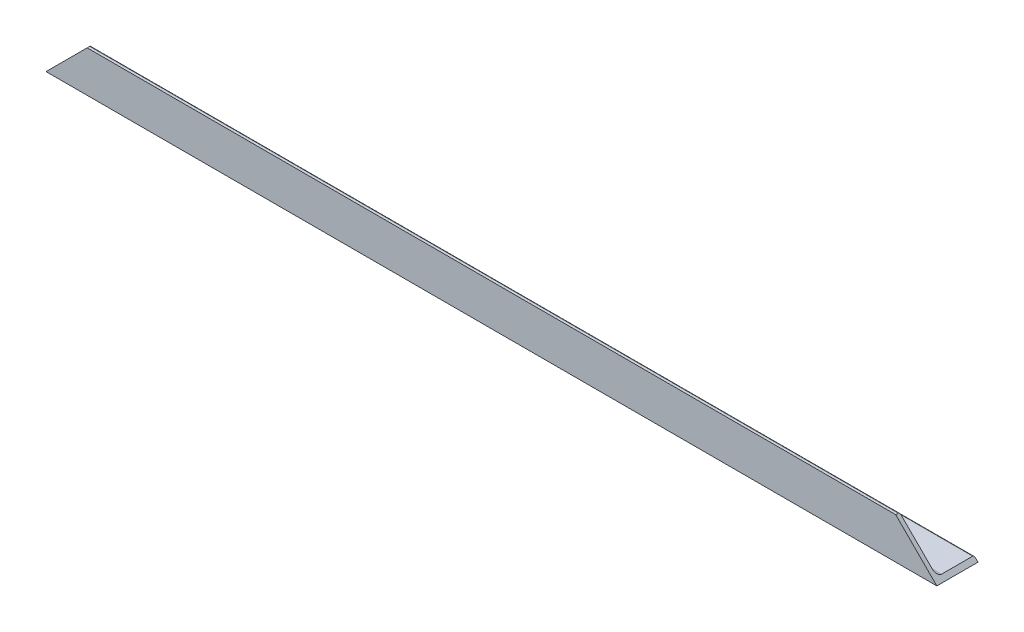
ISO-10303-21;
HEADER;
FILE_DESCRIPTION(('STEP AP214'),'2;1');
FILE_NAME('part.step','',(''),(''),'','','');
FILE_SCHEMA(('AUTOMOTIVE_DESIGN { 1 0 10303 214 1 1 1 1 }'));
ENDSEC;
DATA;
#1=APPLICATION_CONTEXT('core data for automotive mechanical design processes');
#2=APPLICATION_PROTOCOL_DEFINITION('international standard','automotive_design',2000,#1);
#3=PRODUCT_CONTEXT('',#1,'mechanical');
#4=PRODUCT('Part','Part','',(#3));
#5=PRODUCT_RELATED_PRODUCT_CATEGORY('part','',(#4));
#6=PRODUCT_DEFINITION_FORMATION('','',#4);
#7=PRODUCT_DEFINITION_CONTEXT('part definition',#1,'design');
#8=PRODUCT_DEFINITION('design','',#6,#7);
#9=PRODUCT_DEFINITION_SHAPE('','',#8);
#10=(LENGTH_UNIT() NAMED_UNIT(*) SI_UNIT(.MILLI.,.METRE.));
#11=(NAMED_UNIT(*) PLANE_ANGLE_UNIT() SI_UNIT($,.RADIAN.));
#12=(NAMED_UNIT(*) SI_UNIT($,.STERADIAN.) SOLID_ANGLE_UNIT());
#13=UNCERTAINTY_MEASURE_WITH_UNIT(LENGTH_MEASURE(1.E-05),#10,'distance_accuracy_value','');
#14=(GEOMETRIC_REPRESENTATION_CONTEXT(3) GLOBAL_UNCERTAINTY_ASSIGNED_CONTEXT((#13)) GLOBAL_UNIT_ASSIGNED_CONTEXT((#10,
#11,#12)) REPRESENTATION_CONTEXT('',''));
#15=CARTESIAN_POINT('',(0.,0.,0.));
#16=DIRECTION('',(0.,0.,1.));
#17=DIRECTION('',(1.,0.,0.));
#18=AXIS2_PLACEMENT_3D('',#15,#16,#17);
#19=CARTESIAN_POINT('',(-664.354376539067,622.645623460936,482.354376539065));
#20=DIRECTION('',(-0.707106781186548,0.707106781186547,0.));
#21=DIRECTION('',(-0.707106781186547,-0.707106781186548,0.));
#22=AXIS2_PLACEMENT_3D('',#19,#20,#21);
#23=PLANE('',#22);
#24=DIRECTION('',(0.,0.,-1.));
#25=VECTOR('',#24,1.);
#26=CARTESIAN_POINT('',(-619.000000000003,668.,499.999999999962));
#27=LINE('',#26,#25);
#28=CARTESIAN_POINT('',(-619.000000000003,668.,500.000000000001));
#29=VERTEX_POINT('',#28);
#30=CARTESIAN_POINT('',(-619.000000000003,668.,496.300000000001));
#31=VERTEX_POINT('',#30);
#32=EDGE_CURVE('E131',#29,#31,#27,.T.);
#33=ORIENTED_EDGE('',*,*,#32,.T.);
#34=CARTESIAN_POINT('',(-621.300000000003,665.7,496.300000000001));
#35=DIRECTION('',(-0.707106781186548,0.707106781186547,0.));
#36=DIRECTION('',(-0.707106781186547,-0.707106781186548,0.));
#37=AXIS2_PLACEMENT_3D('',#34,#35,#36);
#38=ELLIPSE('',#37,3.25269119345811,2.3);
#39=CARTESIAN_POINT('',(-621.300000000003,665.7,494.000000000001));
#40=VERTEX_POINT('',#39);
#41=EDGE_CURVE('E129',#31,#40,#38,.T.);
#42=ORIENTED_EDGE('',*,*,#41,.T.);
#43=DIRECTION('',(-0.707106781186547,-0.707106781186548,0.));
#44=VECTOR('',#43,1.);
#45=CARTESIAN_POINT('',(30.3499999999982,1317.35,494.000000000007));
#46=LINE('',#45,#44);
#47=CARTESIAN_POINT('',(-669.000000000003,618.,494.));
#48=VERTEX_POINT('',#47);
#49=EDGE_CURVE('E110',#40,#48,#46,.T.);
#50=ORIENTED_EDGE('',*,*,#49,.T.);
#51=CARTESIAN_POINT('',(-669.000000000003,618.,487.));
#52=DIRECTION('',(-0.707106781186548,0.707106781186547,0.));
#53=DIRECTION('',(-0.707106781186547,-0.707106781186548,0.));
#54=AXIS2_PLACEMENT_3D('',#51,#52,#53);
#55=ELLIPSE('',#54,9.89949493661167,7.00000000000001);
#56=CARTESIAN_POINT('',(-676.000000000003,611.,487.));
#57=VERTEX_POINT('',#56);
#58=EDGE_CURVE('E118',#48,#57,#55,.F.);
#59=ORIENTED_EDGE('',*,*,#58,.T.);
#60=DIRECTION('',(0.,0.,-1.));
#61=VECTOR('',#60,1.);
#62=CARTESIAN_POINT('',(-676.000000000003,611.,486.999999999984));
#63=LINE('',#62,#61);
#64=CARTESIAN_POINT('',(-676.000000000002,611.000000000001,439.3));
#65=VERTEX_POINT('',#64);
#66=EDGE_CURVE('E125',#57,#65,#63,.T.);
#67=ORIENTED_EDGE('',*,*,#66,.T.);
#68=CARTESIAN_POINT('',(-678.300000000002,608.700000000001,439.3));
#69=DIRECTION('',(-0.707106781186548,0.707106781186547,0.));
#70=DIRECTION('',(-0.707106781186547,-0.707106781186548,0.));
#71=AXIS2_PLACEMENT_3D('',#68,#69,#70);
#72=ELLIPSE('',#71,3.25269119345815,2.30000000000002);
#73=CARTESIAN_POINT('',(-678.300000000002,608.700000000001,437.));
#74=VERTEX_POINT('',#73);
#75=EDGE_CURVE('E146',#65,#74,#72,.T.);
#76=ORIENTED_EDGE('',*,*,#75,.T.);
#77=DIRECTION('',(-0.707106781186547,-0.707106781186548,0.));
#78=VECTOR('',#77,1.);
#79=CARTESIAN_POINT('',(1.84999999999858,1288.85,437.00000000001));
#80=LINE('',#79,#78);
#81=CARTESIAN_POINT('',(-682.000000000002,605.000000000001,437.));
#82=VERTEX_POINT('',#81);
#83=EDGE_CURVE('E143',#74,#82,#80,.T.);
#84=ORIENTED_EDGE('',*,*,#83,.T.);
#85=DIRECTION('',(0.,0.,1.));
#86=VECTOR('',#85,1.);
#87=CARTESIAN_POINT('',(-682.000000000003,605.,499.999999999986));
#88=LINE('',#87,#86);
#89=CARTESIAN_POINT('',(-682.000000000002,605.,500.));
#90=VERTEX_POINT('',#89);
#91=EDGE_CURVE('E140',#82,#90,#88,.T.);
#92=ORIENTED_EDGE('',*,*,#91,.T.);
#93=DIRECTION('',(0.707106781186547,0.707106781186548,0.));
#94=VECTOR('',#93,1.);
#95=CARTESIAN_POINT('',(31.4999999999982,1318.5,500.000000000007));
#96=LINE('',#95,#94);
#97=EDGE_CURVE('E137',#90,#29,#96,.T.);
#98=ORIENTED_EDGE('',*,*,#97,.T.);
#99=EDGE_LOOP('',(#33,#42,#50,#59,#67,#76,#84,#92,#98));
#100=FACE_BOUND('',#99,.T.);
#101=ADVANCED_FACE('F34',(#100),#23,.T.);
#102=CARTESIAN_POINT('',(682.,618.,487.));
#103=DIRECTION('',(-1.,0.,0.));
#104=DIRECTION('',(0.,0.,1.));
#105=AXIS2_PLACEMENT_3D('',#102,#103,#104);
#106=CYLINDRICAL_SURFACE('',#105,7.00000000000001);
#107=DIRECTION('',(-1.,0.,0.));
#108=VECTOR('',#107,1.);
#109=CARTESIAN_POINT('',(682.,618.,494.));
#110=LINE('',#109,#108);
#111=CARTESIAN_POINT('',(669.,618.,494.));
#112=VERTEX_POINT('',#111);
#113=EDGE_CURVE('E105',#112,#48,#110,.T.);
#114=ORIENTED_EDGE('',*,*,#113,.F.);
#115=CARTESIAN_POINT('',(669.,618.,487.));
#116=DIRECTION('',(-0.707106781186548,-0.707106781186547,0.));
#117=DIRECTION('',(-0.707106781186547,0.707106781186548,0.));
#118=AXIS2_PLACEMENT_3D('',#115,#116,#117);
#119=ELLIPSE('',#118,9.89949493661167,7.00000000000001);
#120=CARTESIAN_POINT('',(676.,611.,487.));
#121=VERTEX_POINT('',#120);
#122=EDGE_CURVE('E37',#112,#121,#119,.F.);
#123=ORIENTED_EDGE('',*,*,#122,.T.);
#124=DIRECTION('',(-1.,0.,0.));
#125=VECTOR('',#124,1.);
#126=CARTESIAN_POINT('',(682.,611.,487.));
#127=LINE('',#126,#125);
#128=EDGE_CURVE('E121',#121,#57,#127,.T.);
#129=ORIENTED_EDGE('',*,*,#128,.T.);
#130=ORIENTED_EDGE('',*,*,#58,.F.);
#131=EDGE_LOOP('',(#114,#123,#129,#130));
#132=FACE_BOUND('',#131,.T.);
#133=ADVANCED_FACE('F119',(#132),#106,.F.);
#134=CARTESIAN_POINT('',(682.,665.7,496.300000000001));
#135=DIRECTION('',(-1.,0.,0.));
#136=DIRECTION('',(0.,0.,1.));
#137=AXIS2_PLACEMENT_3D('',#134,#135,#136);
#138=CYLINDRICAL_SURFACE('',#137,2.3);
#139=DIRECTION('',(-1.,0.,0.));
#140=VECTOR('',#139,1.);
#141=CARTESIAN_POINT('',(682.,668.,496.300000000001));
#142=LINE('',#141,#140);
#143=CARTESIAN_POINT('',(619.,668.,496.300000000001));
#144=VERTEX_POINT('',#143);
#145=EDGE_CURVE('E160',#144,#31,#142,.T.);
#146=ORIENTED_EDGE('',*,*,#145,.F.);
#147=CARTESIAN_POINT('',(621.3,665.7,496.300000000001));
#148=DIRECTION('',(-0.707106781186548,-0.707106781186547,0.));
#149=DIRECTION('',(-0.707106781186547,0.707106781186548,0.));
#150=AXIS2_PLACEMENT_3D('',#147,#148,#149);
#151=ELLIPSE('',#150,3.25269119345811,2.3);
#152=CARTESIAN_POINT('',(621.3,665.7,494.000000000001));
#153=VERTEX_POINT('',#152);
#154=EDGE_CURVE('E42',#144,#153,#151,.T.);
#155=ORIENTED_EDGE('',*,*,#154,.T.);
#156=DIRECTION('',(-1.,0.,0.));
#157=VECTOR('',#156,1.);
#158=CARTESIAN_POINT('',(682.,665.7,494.000000000001));
#159=LINE('',#158,#157);
#160=EDGE_CURVE('E114',#153,#40,#159,.T.);
#161=ORIENTED_EDGE('',*,*,#160,.T.);
#162=ORIENTED_EDGE('',*,*,#41,.F.);
#163=EDGE_LOOP('',(#146,#155,#161,#162));
#164=FACE_BOUND('',#163,.T.);
#165=ADVANCED_FACE('F167',(#164),#138,.T.);
#166=CARTESIAN_POINT('',(682.,665.7,494.000000000001));
#167=DIRECTION('',(0.,0.,1.));
#168=DIRECTION('',(0.,-1.,0.));
#169=AXIS2_PLACEMENT_3D('',#166,#167,#168);
#170=PLANE('',#169);
#171=ORIENTED_EDGE('',*,*,#160,.F.);
#172=DIRECTION('',(0.707106781186547,-0.707106781186548,0.));
#173=VECTOR('',#172,1.);
#174=CARTESIAN_POINT('',(651.65,635.35,494.));
#175=LINE('',#174,#173);
#176=EDGE_CURVE('E11',#153,#112,#175,.T.);
#177=ORIENTED_EDGE('',*,*,#176,.T.);
#178=ORIENTED_EDGE('',*,*,#113,.T.);
#179=ORIENTED_EDGE('',*,*,#49,.F.);
#180=EDGE_LOOP('',(#171,#177,#178,#179));
#181=FACE_BOUND('',#180,.T.);
#182=ADVANCED_FACE('F108',(#181),#170,.F.);
#183=CARTESIAN_POINT('',(682.,611.,487.));
#184=DIRECTION('',(0.,-1.,0.));
#185=DIRECTION('',(0.,0.,-1.));
#186=AXIS2_PLACEMENT_3D('',#183,#184,#185);
#187=PLANE('',#186);
#188=ORIENTED_EDGE('',*,*,#128,.F.);
#189=DIRECTION('',(0.,0.,-1.));
#190=VECTOR('',#189,1.);
#191=CARTESIAN_POINT('',(676.,611.,487.));
#192=LINE('',#191,#190);
#193=CARTESIAN_POINT('',(675.999999999999,611.000000000001,439.3));
#194=VERTEX_POINT('',#193);
#195=EDGE_CURVE('E183',#121,#194,#192,.T.);
#196=ORIENTED_EDGE('',*,*,#195,.T.);
#197=DIRECTION('',(-1.,0.,0.));
#198=VECTOR('',#197,1.);
#199=CARTESIAN_POINT('',(682.,611.000000000001,439.3));
#200=LINE('',#199,#198);
#201=EDGE_CURVE('E115',#194,#65,#200,.T.);
#202=ORIENTED_EDGE('',*,*,#201,.T.);
#203=ORIENTED_EDGE('',*,*,#66,.F.);
#204=EDGE_LOOP('',(#188,#196,#202,#203));
#205=FACE_BOUND('',#204,.T.);
#206=ADVANCED_FACE('F188',(#205),#187,.F.);
#207=CARTESIAN_POINT('',(682.,608.700000000001,439.3));
#208=DIRECTION('',(-1.,0.,0.));
#209=DIRECTION('',(0.,0.,1.));
#210=AXIS2_PLACEMENT_3D('',#207,#208,#209);
#211=CYLINDRICAL_SURFACE('',#210,2.30000000000002);
#212=ORIENTED_EDGE('',*,*,#201,.F.);
#213=CARTESIAN_POINT('',(678.299999999999,608.700000000001,439.3));
#214=DIRECTION('',(-0.707106781186548,-0.707106781186547,0.));
#215=DIRECTION('',(-0.707106781186547,0.707106781186548,0.));
#216=AXIS2_PLACEMENT_3D('',#213,#214,#215);
#217=ELLIPSE('',#216,3.25269119345815,2.30000000000002);
#218=CARTESIAN_POINT('',(678.299999999999,608.700000000001,437.));
#219=VERTEX_POINT('',#218);
#220=EDGE_CURVE('E180',#194,#219,#217,.T.);
#221=ORIENTED_EDGE('',*,*,#220,.T.);
#222=DIRECTION('',(-1.,0.,0.));
#223=VECTOR('',#222,1.);
#224=CARTESIAN_POINT('',(682.,608.700000000001,437.));
#225=LINE('',#224,#223);
#226=EDGE_CURVE('E153',#219,#74,#225,.T.);
#227=ORIENTED_EDGE('',*,*,#226,.T.);
#228=ORIENTED_EDGE('',*,*,#75,.F.);
#229=EDGE_LOOP('',(#212,#221,#227,#228));
#230=FACE_BOUND('',#229,.T.);
#231=ADVANCED_FACE('F192',(#230),#211,.T.);
#232=CARTESIAN_POINT('',(682.,608.700000000001,437.));
#233=DIRECTION('',(0.,0.,1.));
#234=DIRECTION('',(0.,-1.,0.));
#235=AXIS2_PLACEMENT_3D('',#232,#233,#234);
#236=PLANE('',#235);
#237=ORIENTED_EDGE('',*,*,#226,.F.);
#238=DIRECTION('',(0.707106781186547,-0.707106781186548,0.));
#239=VECTOR('',#238,1.);
#240=CARTESIAN_POINT('',(680.149999999999,606.85,437.));
#241=LINE('',#240,#239);
#242=CARTESIAN_POINT('',(681.999999999999,605.000000000001,437.));
#243=VERTEX_POINT('',#242);
#244=EDGE_CURVE('E175',#219,#243,#241,.T.);
#245=ORIENTED_EDGE('',*,*,#244,.T.);
#246=DIRECTION('',(-1.,0.,0.));
#247=VECTOR('',#246,1.);
#248=CARTESIAN_POINT('',(682.,605.000000000001,437.));
#249=LINE('',#248,#247);
#250=EDGE_CURVE('E155',#243,#82,#249,.T.);
#251=ORIENTED_EDGE('',*,*,#250,.T.);
#252=ORIENTED_EDGE('',*,*,#83,.F.);
#253=EDGE_LOOP('',(#237,#245,#251,#252));
#254=FACE_BOUND('',#253,.T.);
#255=ADVANCED_FACE('F195',(#254),#236,.F.);
#256=CARTESIAN_POINT('',(682.,605.,500.));
#257=DIRECTION('',(0.,1.,0.));
#258=DIRECTION('',(0.,0.,1.));
#259=AXIS2_PLACEMENT_3D('',#256,#257,#258);
#260=PLANE('',#259);
#261=ORIENTED_EDGE('',*,*,#250,.F.);
#262=DIRECTION('',(0.,0.,1.));
#263=VECTOR('',#262,1.);
#264=CARTESIAN_POINT('',(682.,605.,500.));
#265=LINE('',#264,#263);
#266=CARTESIAN_POINT('',(682.,605.,500.000000000001));
#267=VERTEX_POINT('',#266);
#268=EDGE_CURVE('E173',#243,#267,#265,.T.);
#269=ORIENTED_EDGE('',*,*,#268,.T.);
#270=DIRECTION('',(-1.,0.,0.));
#271=VECTOR('',#270,1.);
#272=CARTESIAN_POINT('',(682.,605.,500.));
#273=LINE('',#272,#271);
#274=EDGE_CURVE('E157',#267,#90,#273,.T.);
#275=ORIENTED_EDGE('',*,*,#274,.T.);
#276=ORIENTED_EDGE('',*,*,#91,.F.);
#277=EDGE_LOOP('',(#261,#269,#275,#276));
#278=FACE_BOUND('',#277,.T.);
#279=ADVANCED_FACE('F198',(#278),#260,.F.);
#280=CARTESIAN_POINT('',(682.,668.,500.000000000001));
#281=DIRECTION('',(0.,0.,-1.));
#282=DIRECTION('',(0.,1.,0.));
#283=AXIS2_PLACEMENT_3D('',#280,#281,#282);
#284=PLANE('',#283);
#285=ORIENTED_EDGE('',*,*,#274,.F.);
#286=DIRECTION('',(-0.707106781186547,0.707106781186548,0.));
#287=VECTOR('',#286,1.);
#288=CARTESIAN_POINT('',(650.5,636.5,500.));
#289=LINE('',#288,#287);
#290=CARTESIAN_POINT('',(619.,668.,500.000000000001));
#291=VERTEX_POINT('',#290);
#292=EDGE_CURVE('E55',#267,#291,#289,.T.);
#293=ORIENTED_EDGE('',*,*,#292,.T.);
#294=DIRECTION('',(-1.,0.,0.));
#295=VECTOR('',#294,1.);
#296=CARTESIAN_POINT('',(682.,668.,500.000000000001));
#297=LINE('',#296,#295);
#298=EDGE_CURVE('E159',#291,#29,#297,.T.);
#299=ORIENTED_EDGE('',*,*,#298,.T.);
#300=ORIENTED_EDGE('',*,*,#97,.F.);
#301=EDGE_LOOP('',(#285,#293,#299,#300));
#302=FACE_BOUND('',#301,.T.);
#303=ADVANCED_FACE('F171',(#302),#284,.F.);
#304=CARTESIAN_POINT('',(682.,668.,500.000000000001));
#305=DIRECTION('',(0.,-1.,0.));
#306=DIRECTION('',(0.,0.,-1.));
#307=AXIS2_PLACEMENT_3D('',#304,#305,#306);
#308=PLANE('',#307);
#309=ORIENTED_EDGE('',*,*,#298,.F.);
#310=DIRECTION('',(0.,0.,-1.));
#311=VECTOR('',#310,1.);
#312=CARTESIAN_POINT('',(619.,668.,500.000000000002));
#313=LINE('',#312,#311);
#314=EDGE_CURVE('E50',#291,#144,#313,.T.);
#315=ORIENTED_EDGE('',*,*,#314,.T.);
#316=ORIENTED_EDGE('',*,*,#145,.T.);
#317=ORIENTED_EDGE('',*,*,#32,.F.);
#318=EDGE_LOOP('',(#309,#315,#316,#317));
#319=FACE_BOUND('',#318,.T.);
#320=ADVANCED_FACE('F164',(#319),#308,.F.);
#321=CARTESIAN_POINT('',(664.354376539064,622.645623460936,482.354376539065));
#322=DIRECTION('',(-0.707106781186548,-0.707106781186547,0.));
#323=DIRECTION('',(0.707106781186547,-0.707106781186548,0.));
#324=AXIS2_PLACEMENT_3D('',#321,#322,#323);
#325=PLANE('',#324);
#326=ORIENTED_EDGE('',*,*,#314,.F.);
#327=ORIENTED_EDGE('',*,*,#292,.F.);
#328=ORIENTED_EDGE('',*,*,#268,.F.);
#329=ORIENTED_EDGE('',*,*,#244,.F.);
#330=ORIENTED_EDGE('',*,*,#220,.F.);
#331=ORIENTED_EDGE('',*,*,#195,.F.);
#332=ORIENTED_EDGE('',*,*,#122,.F.);
#333=ORIENTED_EDGE('',*,*,#176,.F.);
#334=ORIENTED_EDGE('',*,*,#154,.F.);
#335=EDGE_LOOP('',(#326,#327,#328,#329,#330,#331,#332,#333,#334));
#336=FACE_BOUND('',#335,.T.);
#337=ADVANCED_FACE('F186',(#336),#325,.F.);
#338=CLOSED_SHELL('',(#101,#133,#165,#182,#206,#231,#255,#279,#303,#320,#337));
#339=MANIFOLD_SOLID_BREP('B2',#338);
#340=ADVANCED_BREP_SHAPE_REPRESENTATION('',(#18,#339),#14);
#341=SHAPE_DEFINITION_REPRESENTATION(#9,#340);
ENDSEC;
END-ISO-10303-21;
